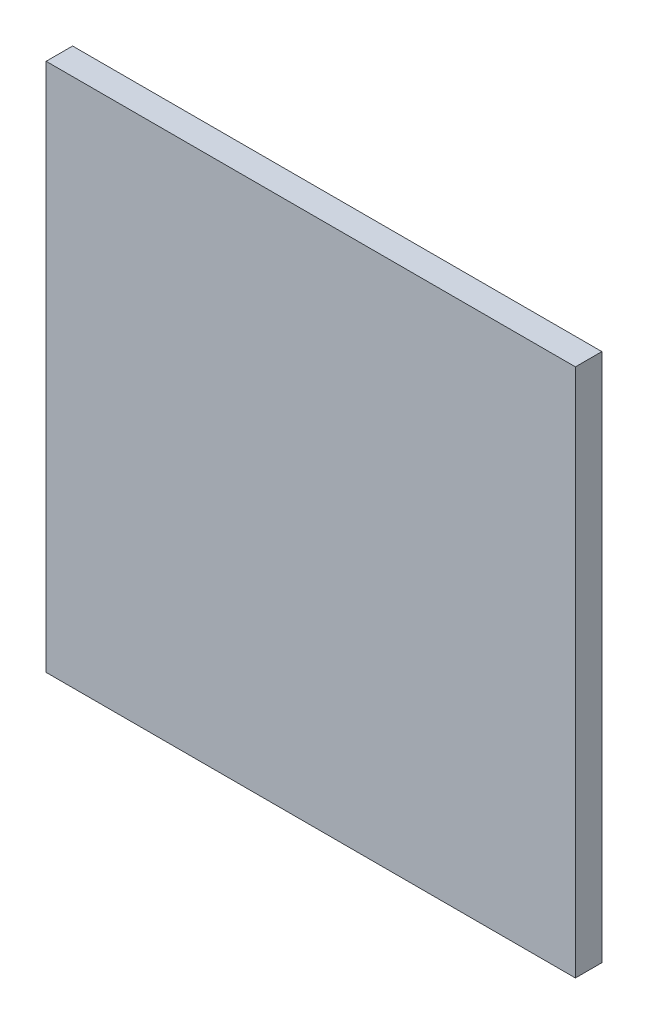
ISO-10303-21;
HEADER;
FILE_DESCRIPTION(('STEP AP214'),'2;1');
FILE_NAME('part.step','',(''),(''),'','','');
FILE_SCHEMA(('AUTOMOTIVE_DESIGN { 1 0 10303 214 1 1 1 1 }'));
ENDSEC;
DATA;
#1=APPLICATION_CONTEXT('core data for automotive mechanical design processes');
#2=APPLICATION_PROTOCOL_DEFINITION('international standard','automotive_design',2000,#1);
#3=PRODUCT_CONTEXT('',#1,'mechanical');
#4=PRODUCT('Part','Part','',(#3));
#5=PRODUCT_RELATED_PRODUCT_CATEGORY('part','',(#4));
#6=PRODUCT_DEFINITION_FORMATION('','',#4);
#7=PRODUCT_DEFINITION_CONTEXT('part definition',#1,'design');
#8=PRODUCT_DEFINITION('design','',#6,#7);
#9=PRODUCT_DEFINITION_SHAPE('','',#8);
#10=(LENGTH_UNIT() NAMED_UNIT(*) SI_UNIT(.MILLI.,.METRE.));
#11=(NAMED_UNIT(*) PLANE_ANGLE_UNIT() SI_UNIT($,.RADIAN.));
#12=(NAMED_UNIT(*) SI_UNIT($,.STERADIAN.) SOLID_ANGLE_UNIT());
#13=UNCERTAINTY_MEASURE_WITH_UNIT(LENGTH_MEASURE(1.E-05),#10,'distance_accuracy_value','');
#14=(GEOMETRIC_REPRESENTATION_CONTEXT(3) GLOBAL_UNCERTAINTY_ASSIGNED_CONTEXT((#13)) GLOBAL_UNIT_ASSIGNED_CONTEXT((#10,
#11,#12)) REPRESENTATION_CONTEXT('',''));
#15=CARTESIAN_POINT('',(0.,0.,0.));
#16=DIRECTION('',(0.,0.,1.));
#17=DIRECTION('',(1.,0.,0.));
#18=AXIS2_PLACEMENT_3D('',#15,#16,#17);
#19=CARTESIAN_POINT('',(0.,0.,0.5));
#20=DIRECTION('',(1.,0.,0.));
#21=DIRECTION('',(0.,1.,0.));
#22=AXIS2_PLACEMENT_3D('',#19,#20,#21);
#23=PLANE('',#22);
#24=DIRECTION('',(0.,-1.,0.));
#25=VECTOR('',#24,1.);
#26=CARTESIAN_POINT('',(0.,0.,0.));
#27=LINE('',#26,#25);
#28=CARTESIAN_POINT('',(0.,0.,0.));
#29=VERTEX_POINT('',#28);
#30=CARTESIAN_POINT('',(0.,-10.,0.));
#31=VERTEX_POINT('',#30);
#32=EDGE_CURVE('E95',#29,#31,#27,.T.);
#33=ORIENTED_EDGE('',*,*,#32,.T.);
#34=DIRECTION('',(0.,0.,-1.));
#35=VECTOR('',#34,1.);
#36=CARTESIAN_POINT('',(0.,-10.,0.5));
#37=LINE('',#36,#35);
#38=CARTESIAN_POINT('',(0.,-10.,0.5));
#39=VERTEX_POINT('',#38);
#40=EDGE_CURVE('E11',#39,#31,#37,.T.);
#41=ORIENTED_EDGE('',*,*,#40,.F.);
#42=DIRECTION('',(0.,-1.,0.));
#43=VECTOR('',#42,1.);
#44=CARTESIAN_POINT('',(0.,0.,0.5));
#45=LINE('',#44,#43);
#46=CARTESIAN_POINT('',(0.,0.,0.5));
#47=VERTEX_POINT('',#46);
#48=EDGE_CURVE('E83',#47,#39,#45,.T.);
#49=ORIENTED_EDGE('',*,*,#48,.F.);
#50=DIRECTION('',(0.,0.,-1.));
#51=VECTOR('',#50,1.);
#52=CARTESIAN_POINT('',(0.,0.,0.5));
#53=LINE('',#52,#51);
#54=EDGE_CURVE('E91',#47,#29,#53,.T.);
#55=ORIENTED_EDGE('',*,*,#54,.T.);
#56=EDGE_LOOP('',(#33,#41,#49,#55));
#57=FACE_BOUND('',#56,.T.);
#58=ADVANCED_FACE('F32',(#57),#23,.F.);
#59=CARTESIAN_POINT('',(0.,-10.,0.5));
#60=DIRECTION('',(0.,1.,0.));
#61=DIRECTION('',(0.,0.,1.));
#62=AXIS2_PLACEMENT_3D('',#59,#60,#61);
#63=PLANE('',#62);
#64=DIRECTION('',(1.,0.,0.));
#65=VECTOR('',#64,1.);
#66=CARTESIAN_POINT('',(0.,-10.,0.));
#67=LINE('',#66,#65);
#68=CARTESIAN_POINT('',(10.,-10.,0.));
#69=VERTEX_POINT('',#68);
#70=EDGE_CURVE('E87',#31,#69,#67,.T.);
#71=ORIENTED_EDGE('',*,*,#70,.T.);
#72=DIRECTION('',(0.,0.,-1.));
#73=VECTOR('',#72,1.);
#74=CARTESIAN_POINT('',(10.,-10.,0.5));
#75=LINE('',#74,#73);
#76=CARTESIAN_POINT('',(10.,-10.,0.5));
#77=VERTEX_POINT('',#76);
#78=EDGE_CURVE('E40',#77,#69,#75,.T.);
#79=ORIENTED_EDGE('',*,*,#78,.F.);
#80=DIRECTION('',(1.,0.,0.));
#81=VECTOR('',#80,1.);
#82=CARTESIAN_POINT('',(0.,-10.,0.5));
#83=LINE('',#82,#81);
#84=EDGE_CURVE('E78',#39,#77,#83,.T.);
#85=ORIENTED_EDGE('',*,*,#84,.F.);
#86=ORIENTED_EDGE('',*,*,#40,.T.);
#87=EDGE_LOOP('',(#71,#79,#85,#86));
#88=FACE_BOUND('',#87,.T.);
#89=ADVANCED_FACE('F86',(#88),#63,.F.);
#90=CARTESIAN_POINT('',(10.,0.,0.5));
#91=DIRECTION('',(-1.,0.,0.));
#92=DIRECTION('',(0.,-1.,0.));
#93=AXIS2_PLACEMENT_3D('',#90,#91,#92);
#94=PLANE('',#93);
#95=DIRECTION('',(0.,1.,0.));
#96=VECTOR('',#95,1.);
#97=CARTESIAN_POINT('',(10.,0.,0.));
#98=LINE('',#97,#96);
#99=CARTESIAN_POINT('',(10.,0.,0.));
#100=VERTEX_POINT('',#99);
#101=EDGE_CURVE('E65',#69,#100,#98,.T.);
#102=ORIENTED_EDGE('',*,*,#101,.T.);
#103=DIRECTION('',(0.,0.,-1.));
#104=VECTOR('',#103,1.);
#105=CARTESIAN_POINT('',(10.,0.,0.5));
#106=LINE('',#105,#104);
#107=CARTESIAN_POINT('',(10.,0.,0.5));
#108=VERTEX_POINT('',#107);
#109=EDGE_CURVE('E88',#108,#100,#106,.T.);
#110=ORIENTED_EDGE('',*,*,#109,.F.);
#111=DIRECTION('',(0.,1.,0.));
#112=VECTOR('',#111,1.);
#113=CARTESIAN_POINT('',(10.,0.,0.5));
#114=LINE('',#113,#112);
#115=EDGE_CURVE('E81',#77,#108,#114,.T.);
#116=ORIENTED_EDGE('',*,*,#115,.F.);
#117=ORIENTED_EDGE('',*,*,#78,.T.);
#118=EDGE_LOOP('',(#102,#110,#116,#117));
#119=FACE_BOUND('',#118,.T.);
#120=ADVANCED_FACE('F89',(#119),#94,.F.);
#121=CARTESIAN_POINT('',(0.,0.,0.5));
#122=DIRECTION('',(0.,-1.,0.));
#123=DIRECTION('',(0.,0.,-1.));
#124=AXIS2_PLACEMENT_3D('',#121,#122,#123);
#125=PLANE('',#124);
#126=DIRECTION('',(-1.,0.,0.));
#127=VECTOR('',#126,1.);
#128=CARTESIAN_POINT('',(0.,0.,0.));
#129=LINE('',#128,#127);
#130=EDGE_CURVE('E71',#100,#29,#129,.T.);
#131=ORIENTED_EDGE('',*,*,#130,.T.);
#132=ORIENTED_EDGE('',*,*,#54,.F.);
#133=DIRECTION('',(-1.,0.,0.));
#134=VECTOR('',#133,1.);
#135=CARTESIAN_POINT('',(0.,0.,0.5));
#136=LINE('',#135,#134);
#137=EDGE_CURVE('E48',#108,#47,#136,.T.);
#138=ORIENTED_EDGE('',*,*,#137,.F.);
#139=ORIENTED_EDGE('',*,*,#109,.T.);
#140=EDGE_LOOP('',(#131,#132,#138,#139));
#141=FACE_BOUND('',#140,.T.);
#142=ADVANCED_FACE('F102',(#141),#125,.F.);
#143=CARTESIAN_POINT('',(0.,0.,0.5));
#144=DIRECTION('',(0.,0.,1.));
#145=DIRECTION('',(1.,0.,0.));
#146=AXIS2_PLACEMENT_3D('',#143,#144,#145);
#147=PLANE('',#146);
#148=ORIENTED_EDGE('',*,*,#48,.T.);
#149=ORIENTED_EDGE('',*,*,#84,.T.);
#150=ORIENTED_EDGE('',*,*,#115,.T.);
#151=ORIENTED_EDGE('',*,*,#137,.T.);
#152=EDGE_LOOP('',(#148,#149,#150,#151));
#153=FACE_BOUND('',#152,.T.);
#154=ADVANCED_FACE('F79',(#153),#147,.T.);
#155=CARTESIAN_POINT('',(0.,0.,0.));
#156=DIRECTION('',(0.,0.,1.));
#157=DIRECTION('',(1.,0.,0.));
#158=AXIS2_PLACEMENT_3D('',#155,#156,#157);
#159=PLANE('',#158);
#160=ORIENTED_EDGE('',*,*,#32,.F.);
#161=ORIENTED_EDGE('',*,*,#130,.F.);
#162=ORIENTED_EDGE('',*,*,#101,.F.);
#163=ORIENTED_EDGE('',*,*,#70,.F.);
#164=EDGE_LOOP('',(#160,#161,#162,#163));
#165=FACE_BOUND('',#164,.T.);
#166=ADVANCED_FACE('F105',(#165),#159,.F.);
#167=CLOSED_SHELL('',(#58,#89,#120,#142,#154,#166));
#168=MANIFOLD_SOLID_BREP('B2',#167);
#169=ADVANCED_BREP_SHAPE_REPRESENTATION('',(#18,#168),#14);
#170=SHAPE_DEFINITION_REPRESENTATION(#9,#169);
ENDSEC;
END-ISO-10303-21;
